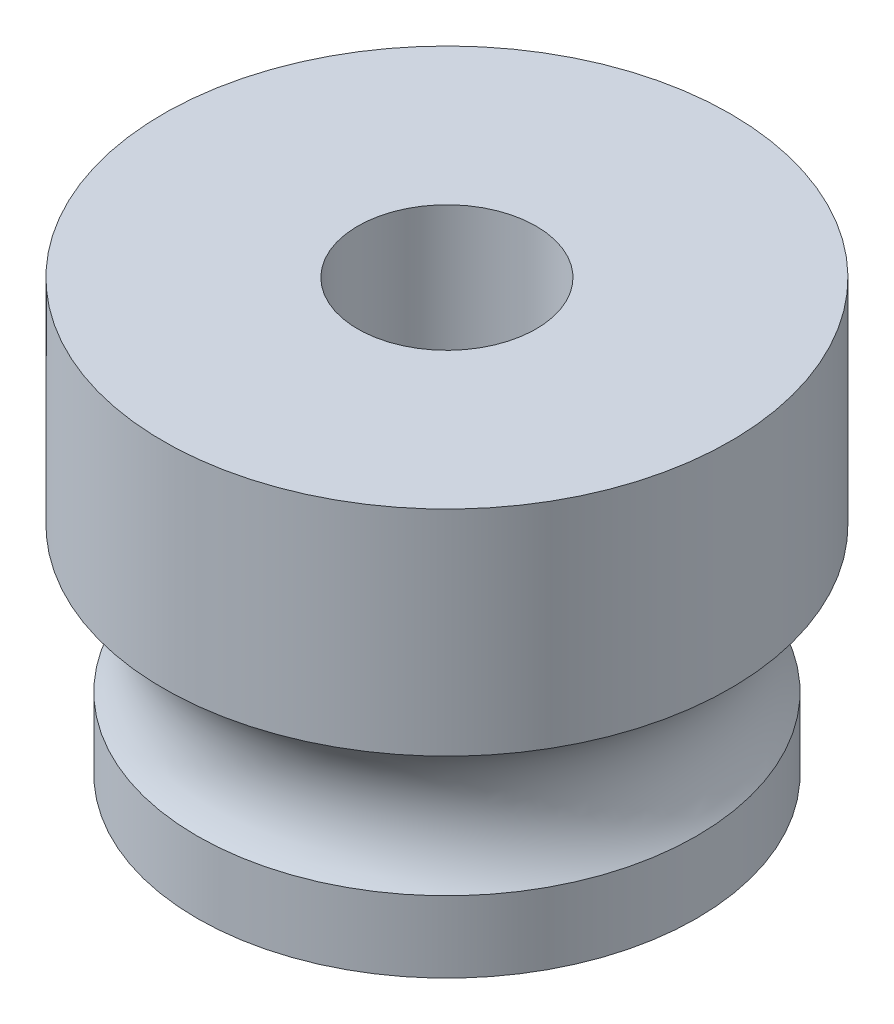
ISO-10303-21;
HEADER;
FILE_DESCRIPTION(('STEP AP214'),'2;1');
FILE_NAME('part.step','',(''),(''),'','','');
FILE_SCHEMA(('AUTOMOTIVE_DESIGN { 1 0 10303 214 1 1 1 1 }'));
ENDSEC;
DATA;
#1=APPLICATION_CONTEXT('core data for automotive mechanical design processes');
#2=APPLICATION_PROTOCOL_DEFINITION('international standard','automotive_design',2000,#1);
#3=PRODUCT_CONTEXT('',#1,'mechanical');
#4=PRODUCT('Part','Part','',(#3));
#5=PRODUCT_RELATED_PRODUCT_CATEGORY('part','',(#4));
#6=PRODUCT_DEFINITION_FORMATION('','',#4);
#7=PRODUCT_DEFINITION_CONTEXT('part definition',#1,'design');
#8=PRODUCT_DEFINITION('design','',#6,#7);
#9=PRODUCT_DEFINITION_SHAPE('','',#8);
#10=(LENGTH_UNIT() NAMED_UNIT(*) SI_UNIT(.MILLI.,.METRE.));
#11=(NAMED_UNIT(*) PLANE_ANGLE_UNIT() SI_UNIT($,.RADIAN.));
#12=(NAMED_UNIT(*) SI_UNIT($,.STERADIAN.) SOLID_ANGLE_UNIT());
#13=UNCERTAINTY_MEASURE_WITH_UNIT(LENGTH_MEASURE(1.E-05),#10,'distance_accuracy_value','');
#14=(GEOMETRIC_REPRESENTATION_CONTEXT(3) GLOBAL_UNCERTAINTY_ASSIGNED_CONTEXT((#13)) GLOBAL_UNIT_ASSIGNED_CONTEXT((#10,
#11,#12)) REPRESENTATION_CONTEXT('',''));
#15=CARTESIAN_POINT('',(0.,0.,0.));
#16=DIRECTION('',(0.,0.,1.));
#17=DIRECTION('',(1.,0.,0.));
#18=AXIS2_PLACEMENT_3D('',#15,#16,#17);
#19=CARTESIAN_POINT('',(0.,0.,0.));
#20=DIRECTION('',(0.,-1.,0.));
#21=DIRECTION('',(0.,0.,-1.));
#22=AXIS2_PLACEMENT_3D('',#19,#20,#21);
#23=PLANE('',#22);
#24=CARTESIAN_POINT('',(0.,0.,0.));
#25=DIRECTION('',(0.,-1.,0.));
#26=DIRECTION('',(0.,0.,-1.));
#27=AXIS2_PLACEMENT_3D('',#24,#25,#26);
#28=CIRCLE('',#27,1.24999999999999);
#29=CARTESIAN_POINT('',(0.,0.,-1.24999999999999));
#30=VERTEX_POINT('',#29);
#31=EDGE_CURVE('E56',#30,#30,#28,.T.);
#32=ORIENTED_EDGE('',*,*,#31,.F.);
#33=EDGE_LOOP('',(#32));
#34=FACE_BOUND('',#33,.T.);
#35=CARTESIAN_POINT('',(0.,0.,0.));
#36=DIRECTION('',(0.,-1.,0.));
#37=DIRECTION('',(0.,0.,-1.));
#38=AXIS2_PLACEMENT_3D('',#35,#36,#37);
#39=CIRCLE('',#38,3.5);
#40=CARTESIAN_POINT('',(0.,0.,-3.5));
#41=VERTEX_POINT('',#40);
#42=EDGE_CURVE('E10',#41,#41,#39,.T.);
#43=ORIENTED_EDGE('',*,*,#42,.T.);
#44=EDGE_LOOP('',(#43));
#45=FACE_BOUND('',#44,.T.);
#46=ADVANCED_FACE('F34',(#34,#45),#23,.T.);
#47=CARTESIAN_POINT('',(0.,-9.64388059954606,0.));
#48=DIRECTION('',(0.,-1.,0.));
#49=DIRECTION('',(0.,0.,-1.));
#50=AXIS2_PLACEMENT_3D('',#47,#48,#49);
#51=CYLINDRICAL_SURFACE('',#50,3.5);
#52=CARTESIAN_POINT('',(0.,1.,0.));
#53=DIRECTION('',(0.,-1.,0.));
#54=DIRECTION('',(0.,0.,-1.));
#55=AXIS2_PLACEMENT_3D('',#52,#53,#54);
#56=CIRCLE('',#55,3.5);
#57=CARTESIAN_POINT('',(0.,1.,-3.5));
#58=VERTEX_POINT('',#57);
#59=EDGE_CURVE('E40',#58,#58,#56,.T.);
#60=ORIENTED_EDGE('',*,*,#59,.T.);
#61=EDGE_LOOP('',(#60));
#62=FACE_BOUND('',#61,.T.);
#63=ORIENTED_EDGE('',*,*,#42,.F.);
#64=EDGE_LOOP('',(#63));
#65=FACE_BOUND('',#64,.T.);
#66=ADVANCED_FACE('F63',(#62,#65),#51,.T.);
#67=CARTESIAN_POINT('',(0.,1.83658251231527,0.));
#68=DIRECTION('',(0.,-1.,0.));
#69=DIRECTION('',(0.,0.,-1.));
#70=AXIS2_PLACEMENT_3D('',#67,#68,#69);
#71=TOROIDAL_SURFACE('',#70,4.5,1.30379074237844);
#72=ORIENTED_EDGE('',*,*,#59,.F.);
#73=EDGE_LOOP('',(#72));
#74=FACE_BOUND('',#73,.T.);
#75=CARTESIAN_POINT('',(0.,3.03,0.));
#76=DIRECTION('',(0.,-1.,0.));
#77=DIRECTION('',(0.,0.,-1.));
#78=AXIS2_PLACEMENT_3D('',#75,#76,#77);
#79=CIRCLE('',#78,3.975);
#80=CARTESIAN_POINT('',(0.,3.03,-3.975));
#81=VERTEX_POINT('',#80);
#82=EDGE_CURVE('E44',#81,#81,#79,.T.);
#83=ORIENTED_EDGE('',*,*,#82,.T.);
#84=EDGE_LOOP('',(#83));
#85=FACE_BOUND('',#84,.T.);
#86=ADVANCED_FACE('F67',(#74,#85),#71,.F.);
#87=CARTESIAN_POINT('',(0.,-9.64388059954606,0.));
#88=DIRECTION('',(0.,-1.,0.));
#89=DIRECTION('',(0.,0.,-1.));
#90=AXIS2_PLACEMENT_3D('',#87,#88,#89);
#91=CYLINDRICAL_SURFACE('',#90,3.975);
#92=ORIENTED_EDGE('',*,*,#82,.F.);
#93=EDGE_LOOP('',(#92));
#94=FACE_BOUND('',#93,.T.);
#95=CARTESIAN_POINT('',(0.,6.03,0.));
#96=DIRECTION('',(0.,-1.,0.));
#97=DIRECTION('',(0.,0.,-1.));
#98=AXIS2_PLACEMENT_3D('',#95,#96,#97);
#99=CIRCLE('',#98,3.975);
#100=CARTESIAN_POINT('',(0.,6.03,-3.975));
#101=VERTEX_POINT('',#100);
#102=EDGE_CURVE('E48',#101,#101,#99,.T.);
#103=ORIENTED_EDGE('',*,*,#102,.T.);
#104=EDGE_LOOP('',(#103));
#105=FACE_BOUND('',#104,.T.);
#106=ADVANCED_FACE('F71',(#94,#105),#91,.T.);
#107=CARTESIAN_POINT('',(0.,6.03,0.));
#108=DIRECTION('',(0.,-1.,0.));
#109=DIRECTION('',(0.,0.,-1.));
#110=AXIS2_PLACEMENT_3D('',#107,#108,#109);
#111=PLANE('',#110);
#112=CARTESIAN_POINT('',(0.,6.03,0.));
#113=DIRECTION('',(0.,-1.,0.));
#114=DIRECTION('',(0.,0.,-1.));
#115=AXIS2_PLACEMENT_3D('',#112,#113,#114);
#116=CIRCLE('',#115,1.25);
#117=CARTESIAN_POINT('',(0.,6.03,-1.25));
#118=VERTEX_POINT('',#117);
#119=EDGE_CURVE('E53',#118,#118,#116,.T.);
#120=ORIENTED_EDGE('',*,*,#119,.T.);
#121=EDGE_LOOP('',(#120));
#122=FACE_BOUND('',#121,.T.);
#123=ORIENTED_EDGE('',*,*,#102,.F.);
#124=EDGE_LOOP('',(#123));
#125=FACE_BOUND('',#124,.T.);
#126=ADVANCED_FACE('F78',(#122,#125),#111,.F.);
#127=CARTESIAN_POINT('',(0.,0.,0.));
#128=DIRECTION('',(0.,-1.,0.));
#129=DIRECTION('',(0.,0.,-1.));
#130=AXIS2_PLACEMENT_3D('',#127,#128,#129);
#131=CYLINDRICAL_SURFACE('',#130,1.24999999999999);
#132=ORIENTED_EDGE('',*,*,#119,.F.);
#133=EDGE_LOOP('',(#132));
#134=FACE_BOUND('',#133,.T.);
#135=ORIENTED_EDGE('',*,*,#31,.T.);
#136=EDGE_LOOP('',(#135));
#137=FACE_BOUND('',#136,.T.);
#138=ADVANCED_FACE('F60',(#134,#137),#131,.F.);
#139=CLOSED_SHELL('',(#46,#66,#86,#106,#126,#138));
#140=MANIFOLD_SOLID_BREP('B2',#139);
#141=ADVANCED_BREP_SHAPE_REPRESENTATION('',(#18,#140),#14);
#142=SHAPE_DEFINITION_REPRESENTATION(#9,#141);
ENDSEC;
END-ISO-10303-21;
